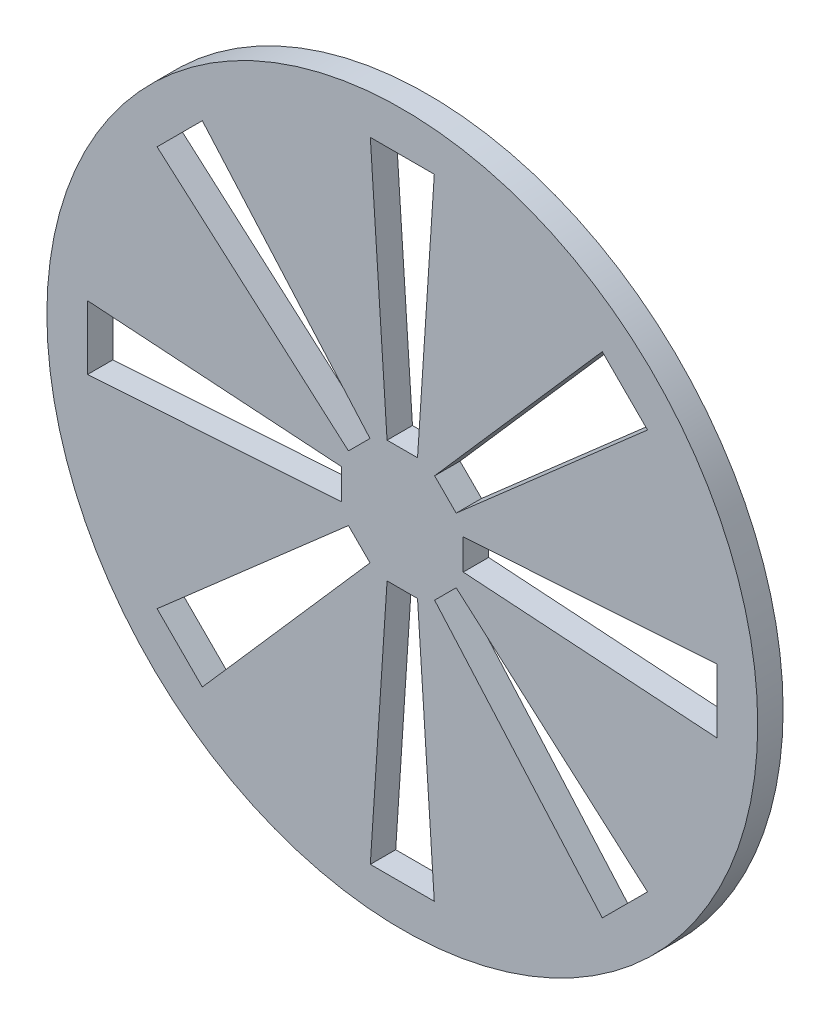
ISO-10303-21;
HEADER;
FILE_DESCRIPTION(('STEP AP214'),'2;1');
FILE_NAME('part.step','',(''),(''),'','','');
FILE_SCHEMA(('AUTOMOTIVE_DESIGN { 1 0 10303 214 1 1 1 1 }'));
ENDSEC;
DATA;
#1=APPLICATION_CONTEXT('core data for automotive mechanical design processes');
#2=APPLICATION_PROTOCOL_DEFINITION('international standard','automotive_design',2000,#1);
#3=PRODUCT_CONTEXT('',#1,'mechanical');
#4=PRODUCT('Part','Part','',(#3));
#5=PRODUCT_RELATED_PRODUCT_CATEGORY('part','',(#4));
#6=PRODUCT_DEFINITION_FORMATION('','',#4);
#7=PRODUCT_DEFINITION_CONTEXT('part definition',#1,'design');
#8=PRODUCT_DEFINITION('design','',#6,#7);
#9=PRODUCT_DEFINITION_SHAPE('','',#8);
#10=(LENGTH_UNIT() NAMED_UNIT(*) SI_UNIT(.MILLI.,.METRE.));
#11=(NAMED_UNIT(*) PLANE_ANGLE_UNIT() SI_UNIT($,.RADIAN.));
#12=(NAMED_UNIT(*) SI_UNIT($,.STERADIAN.) SOLID_ANGLE_UNIT());
#13=UNCERTAINTY_MEASURE_WITH_UNIT(LENGTH_MEASURE(1.E-05),#10,'distance_accuracy_value','');
#14=(GEOMETRIC_REPRESENTATION_CONTEXT(3) GLOBAL_UNCERTAINTY_ASSIGNED_CONTEXT((#13)) GLOBAL_UNIT_ASSIGNED_CONTEXT((#10,
#11,#12)) REPRESENTATION_CONTEXT('',''));
#15=CARTESIAN_POINT('',(0.,0.,0.));
#16=DIRECTION('',(0.,0.,1.));
#17=DIRECTION('',(1.,0.,0.));
#18=AXIS2_PLACEMENT_3D('',#15,#16,#17);
#19=CARTESIAN_POINT('',(0.,0.,2.5));
#20=DIRECTION('',(0.,0.,1.));
#21=DIRECTION('',(1.,0.,0.));
#22=AXIS2_PLACEMENT_3D('',#19,#20,#21);
#23=PLANE('',#22);
#24=CARTESIAN_POINT('',(0.,0.,2.5));
#25=DIRECTION('',(0.,0.,1.));
#26=DIRECTION('',(1.,0.,0.));
#27=AXIS2_PLACEMENT_3D('',#24,#25,#26);
#28=CIRCLE('',#27,35.);
#29=CARTESIAN_POINT('',(35.,0.,2.5));
#30=VERTEX_POINT('',#29);
#31=EDGE_CURVE('E11',#30,#30,#28,.T.);
#32=ORIENTED_EDGE('',*,*,#31,.T.);
#33=EDGE_LOOP('',(#32));
#34=FACE_BOUND('',#33,.T.);
#35=DIRECTION('',(1.,0.,0.));
#36=VECTOR('',#35,1.);
#37=CARTESIAN_POINT('',(-1.5,6.,2.5));
#38=LINE('',#37,#36);
#39=CARTESIAN_POINT('',(-1.5,6.,2.5));
#40=VERTEX_POINT('',#39);
#41=CARTESIAN_POINT('',(1.5,6.,2.5));
#42=VERTEX_POINT('',#41);
#43=EDGE_CURVE('E470',#40,#42,#38,.T.);
#44=ORIENTED_EDGE('',*,*,#43,.F.);
#45=DIRECTION('',(0.0658567199264505,-0.997829089794705,0.));
#46=VECTOR('',#45,1.);
#47=CARTESIAN_POINT('',(-3.15,31.,2.5));
#48=LINE('',#47,#46);
#49=CARTESIAN_POINT('',(-3.15,31.,2.5));
#50=VERTEX_POINT('',#49);
#51=EDGE_CURVE('E468',#50,#40,#48,.T.);
#52=ORIENTED_EDGE('',*,*,#51,.F.);
#53=DIRECTION('',(-1.,0.,0.));
#54=VECTOR('',#53,1.);
#55=CARTESIAN_POINT('',(3.15,31.,2.5));
#56=LINE('',#55,#54);
#57=CARTESIAN_POINT('',(3.15,31.,2.5));
#58=VERTEX_POINT('',#57);
#59=EDGE_CURVE('E476',#58,#50,#56,.T.);
#60=ORIENTED_EDGE('',*,*,#59,.F.);
#61=DIRECTION('',(0.0658567199264505,0.997829089794705,0.));
#62=VECTOR('',#61,1.);
#63=CARTESIAN_POINT('',(3.15,31.,2.5));
#64=LINE('',#63,#62);
#65=EDGE_CURVE('E473',#42,#58,#64,.T.);
#66=ORIENTED_EDGE('',*,*,#65,.F.);
#67=EDGE_LOOP('',(#44,#52,#60,#66));
#68=FACE_BOUND('',#67,.T.);
#69=DIRECTION('',(-0.659003982612336,-0.752139449105736,0.));
#70=VECTOR('',#69,1.);
#71=CARTESIAN_POINT('',(19.6929238560454,24.1476965775208,2.5));
#72=LINE('',#71,#70);
#73=CARTESIAN_POINT('',(19.6929238560454,24.1476965775208,2.5));
#74=VERTEX_POINT('',#73);
#75=CARTESIAN_POINT('',(3.18198051533947,5.3033008588991,2.5));
#76=VERTEX_POINT('',#75);
#77=EDGE_CURVE('E439',#74,#76,#72,.T.);
#78=ORIENTED_EDGE('',*,*,#77,.F.);
#79=DIRECTION('',(-0.707106781186548,0.707106781186548,0.));
#80=VECTOR('',#79,1.);
#81=CARTESIAN_POINT('',(24.1476965775206,19.6929238560455,2.5));
#82=LINE('',#81,#80);
#83=CARTESIAN_POINT('',(24.1476965775206,19.6929238560455,2.5));
#84=VERTEX_POINT('',#83);
#85=EDGE_CURVE('E437',#84,#74,#82,.T.);
#86=ORIENTED_EDGE('',*,*,#85,.F.);
#87=DIRECTION('',(0.752139449105729,0.659003982612344,0.));
#88=VECTOR('',#87,1.);
#89=CARTESIAN_POINT('',(24.1476965775206,19.6929238560455,2.5));
#90=LINE('',#89,#88);
#91=CARTESIAN_POINT('',(5.30330085889911,3.18198051533946,2.5));
#92=VERTEX_POINT('',#91);
#93=EDGE_CURVE('E445',#92,#84,#90,.T.);
#94=ORIENTED_EDGE('',*,*,#93,.F.);
#95=DIRECTION('',(0.707106781186546,-0.707106781186549,0.));
#96=VECTOR('',#95,1.);
#97=CARTESIAN_POINT('',(3.18198051533947,5.3033008588991,2.5));
#98=LINE('',#97,#96);
#99=EDGE_CURVE('E442',#76,#92,#98,.T.);
#100=ORIENTED_EDGE('',*,*,#99,.F.);
#101=EDGE_LOOP('',(#78,#86,#94,#100));
#102=FACE_BOUND('',#101,.T.);
#103=DIRECTION('',(-0.997829089794704,-0.0658567199264636,0.));
#104=VECTOR('',#103,1.);
#105=CARTESIAN_POINT('',(31.0000000000002,3.15000000000032,2.5));
#106=LINE('',#105,#104);
#107=CARTESIAN_POINT('',(31.0000000000002,3.15000000000032,2.5));
#108=VERTEX_POINT('',#107);
#109=CARTESIAN_POINT('',(6.00000000000001,1.49999999999998,2.5));
#110=VERTEX_POINT('',#109);
#111=EDGE_CURVE('E408',#108,#110,#106,.T.);
#112=ORIENTED_EDGE('',*,*,#111,.F.);
#113=DIRECTION('',(0.,1.,0.));
#114=VECTOR('',#113,1.);
#115=CARTESIAN_POINT('',(31.0000000000002,-3.14999999999968,2.5));
#116=LINE('',#115,#114);
#117=CARTESIAN_POINT('',(31.0000000000002,-3.14999999999968,2.5));
#118=VERTEX_POINT('',#117);
#119=EDGE_CURVE('E406',#118,#108,#116,.T.);
#120=ORIENTED_EDGE('',*,*,#119,.F.);
#121=DIRECTION('',(0.997829089794706,-0.0658567199264364,0.));
#122=VECTOR('',#121,1.);
#123=CARTESIAN_POINT('',(31.0000000000002,-3.14999999999968,2.5));
#124=LINE('',#123,#122);
#125=CARTESIAN_POINT('',(5.99999999999999,-1.50000000000002,2.5));
#126=VERTEX_POINT('',#125);
#127=EDGE_CURVE('E414',#126,#118,#124,.T.);
#128=ORIENTED_EDGE('',*,*,#127,.F.);
#129=DIRECTION('',(0.,-1.,0.));
#130=VECTOR('',#129,1.);
#131=CARTESIAN_POINT('',(6.00000000000001,1.49999999999998,2.5));
#132=LINE('',#131,#130);
#133=EDGE_CURVE('E411',#110,#126,#132,.T.);
#134=ORIENTED_EDGE('',*,*,#133,.F.);
#135=EDGE_LOOP('',(#112,#120,#128,#134));
#136=FACE_BOUND('',#135,.T.);
#137=DIRECTION('',(-0.752139449105746,0.659003982612325,0.));
#138=VECTOR('',#137,1.);
#139=CARTESIAN_POINT('',(24.147696577521,-19.6929238560451,2.5));
#140=LINE('',#139,#138);
#141=CARTESIAN_POINT('',(24.147696577521,-19.6929238560451,2.5));
#142=VERTEX_POINT('',#141);
#143=CARTESIAN_POINT('',(5.30330085889909,-3.18198051533949,2.5));
#144=VERTEX_POINT('',#143);
#145=EDGE_CURVE('E377',#142,#144,#140,.T.);
#146=ORIENTED_EDGE('',*,*,#145,.F.);
#147=DIRECTION('',(0.707106781186548,0.707106781186548,0.));
#148=VECTOR('',#147,1.);
#149=CARTESIAN_POINT('',(19.6929238560457,-24.1476965775203,2.5));
#150=LINE('',#149,#148);
#151=CARTESIAN_POINT('',(19.6929238560457,-24.1476965775203,2.5));
#152=VERTEX_POINT('',#151);
#153=EDGE_CURVE('E375',#152,#142,#150,.T.);
#154=ORIENTED_EDGE('',*,*,#153,.F.);
#155=DIRECTION('',(0.659003982612355,-0.752139449105719,0.));
#156=VECTOR('',#155,1.);
#157=CARTESIAN_POINT('',(19.6929238560457,-24.1476965775203,2.5));
#158=LINE('',#157,#156);
#159=CARTESIAN_POINT('',(3.18198051533944,-5.30330085889912,2.5));
#160=VERTEX_POINT('',#159);
#161=EDGE_CURVE('E383',#160,#152,#158,.T.);
#162=ORIENTED_EDGE('',*,*,#161,.F.);
#163=DIRECTION('',(-0.707106781186551,-0.707106781186544,0.));
#164=VECTOR('',#163,1.);
#165=CARTESIAN_POINT('',(5.30330085889909,-3.18198051533949,2.5));
#166=LINE('',#165,#164);
#167=EDGE_CURVE('E380',#144,#160,#166,.T.);
#168=ORIENTED_EDGE('',*,*,#167,.F.);
#169=EDGE_LOOP('',(#146,#154,#162,#168));
#170=FACE_BOUND('',#169,.T.);
#171=DIRECTION('',(-0.0658567199264506,0.997829089794705,0.));
#172=VECTOR('',#171,1.);
#173=CARTESIAN_POINT('',(3.15000000000051,-30.9999999999999,2.5));
#174=LINE('',#173,#172);
#175=CARTESIAN_POINT('',(3.15000000000051,-30.9999999999999,2.5));
#176=VERTEX_POINT('',#175);
#177=CARTESIAN_POINT('',(1.50000000000051,-5.99999999999988,2.5));
#178=VERTEX_POINT('',#177);
#179=EDGE_CURVE('E346',#176,#178,#174,.T.);
#180=ORIENTED_EDGE('',*,*,#179,.F.);
#181=DIRECTION('',(1.,0.,0.));
#182=VECTOR('',#181,1.);
#183=CARTESIAN_POINT('',(-3.14999999999949,-30.9999999999999,2.5));
#184=LINE('',#183,#182);
#185=CARTESIAN_POINT('',(-3.14999999999949,-30.9999999999999,2.5));
#186=VERTEX_POINT('',#185);
#187=EDGE_CURVE('E344',#186,#176,#184,.T.);
#188=ORIENTED_EDGE('',*,*,#187,.F.);
#189=DIRECTION('',(-0.0658567199264504,-0.997829089794705,0.));
#190=VECTOR('',#189,1.);
#191=CARTESIAN_POINT('',(-3.14999999999949,-30.9999999999999,2.5));
#192=LINE('',#191,#190);
#193=CARTESIAN_POINT('',(-1.49999999999949,-5.99999999999988,2.5));
#194=VERTEX_POINT('',#193);
#195=EDGE_CURVE('E352',#194,#186,#192,.T.);
#196=ORIENTED_EDGE('',*,*,#195,.F.);
#197=DIRECTION('',(-1.,0.,0.));
#198=VECTOR('',#197,1.);
#199=CARTESIAN_POINT('',(1.50000000000051,-5.99999999999988,2.5));
#200=LINE('',#199,#198);
#201=EDGE_CURVE('E349',#178,#194,#200,.T.);
#202=ORIENTED_EDGE('',*,*,#201,.F.);
#203=EDGE_LOOP('',(#180,#188,#196,#202));
#204=FACE_BOUND('',#203,.T.);
#205=DIRECTION('',(0.659003982612326,0.752139449105745,0.));
#206=VECTOR('',#205,1.);
#207=CARTESIAN_POINT('',(-19.6929238560449,-24.1476965775207,2.5));
#208=LINE('',#207,#206);
#209=CARTESIAN_POINT('',(-19.6929238560449,-24.1476965775207,2.5));
#210=VERTEX_POINT('',#209);
#211=CARTESIAN_POINT('',(-3.18198051533951,-5.30330085889908,2.5));
#212=VERTEX_POINT('',#211);
#213=EDGE_CURVE('E315',#210,#212,#208,.T.);
#214=ORIENTED_EDGE('',*,*,#213,.F.);
#215=DIRECTION('',(0.707106781186547,-0.707106781186547,0.));
#216=VECTOR('',#215,1.);
#217=CARTESIAN_POINT('',(-24.1476965775201,-19.6929238560454,2.5));
#218=LINE('',#217,#216);
#219=CARTESIAN_POINT('',(-24.1476965775201,-19.6929238560454,2.5));
#220=VERTEX_POINT('',#219);
#221=EDGE_CURVE('E313',#220,#210,#218,.T.);
#222=ORIENTED_EDGE('',*,*,#221,.F.);
#223=DIRECTION('',(-0.752139449105721,-0.659003982612353,0.));
#224=VECTOR('',#223,1.);
#225=CARTESIAN_POINT('',(-24.1476965775201,-19.6929238560454,2.5));
#226=LINE('',#225,#224);
#227=CARTESIAN_POINT('',(-5.30330085889914,-3.18198051533942,2.5));
#228=VERTEX_POINT('',#227);
#229=EDGE_CURVE('E321',#228,#220,#226,.T.);
#230=ORIENTED_EDGE('',*,*,#229,.F.);
#231=DIRECTION('',(-0.707106781186541,0.707106781186554,0.));
#232=VECTOR('',#231,1.);
#233=CARTESIAN_POINT('',(-3.18198051533951,-5.30330085889908,2.5));
#234=LINE('',#233,#232);
#235=EDGE_CURVE('E318',#212,#228,#234,.T.);
#236=ORIENTED_EDGE('',*,*,#235,.F.);
#237=EDGE_LOOP('',(#214,#222,#230,#236));
#238=FACE_BOUND('',#237,.T.);
#239=DIRECTION('',(0.997829089794704,0.0658567199264618,0.));
#240=VECTOR('',#239,1.);
#241=CARTESIAN_POINT('',(-30.9999999999997,-3.1500000000002,2.5));
#242=LINE('',#241,#240);
#243=CARTESIAN_POINT('',(-30.9999999999997,-3.1500000000002,2.5));
#244=VERTEX_POINT('',#243);
#245=CARTESIAN_POINT('',(-6.00000000000002,-1.49999999999994,2.5));
#246=VERTEX_POINT('',#245);
#247=EDGE_CURVE('E284',#244,#246,#242,.T.);
#248=ORIENTED_EDGE('',*,*,#247,.F.);
#249=DIRECTION('',(0.,-1.,0.));
#250=VECTOR('',#249,1.);
#251=CARTESIAN_POINT('',(-30.9999999999997,3.1499999999998,2.5));
#252=LINE('',#251,#250);
#253=CARTESIAN_POINT('',(-30.9999999999997,3.1499999999998,2.5));
#254=VERTEX_POINT('',#253);
#255=EDGE_CURVE('E282',#254,#244,#252,.T.);
#256=ORIENTED_EDGE('',*,*,#255,.F.);
#257=DIRECTION('',(-0.997829089794705,0.065856719926441,0.));
#258=VECTOR('',#257,1.);
#259=CARTESIAN_POINT('',(-30.9999999999997,3.1499999999998,2.5));
#260=LINE('',#259,#258);
#261=CARTESIAN_POINT('',(-5.99999999999999,1.50000000000006,2.5));
#262=VERTEX_POINT('',#261);
#263=EDGE_CURVE('E290',#262,#254,#260,.T.);
#264=ORIENTED_EDGE('',*,*,#263,.F.);
#265=DIRECTION('',(0.,1.,0.));
#266=VECTOR('',#265,1.);
#267=CARTESIAN_POINT('',(-6.00000000000002,-1.49999999999994,2.5));
#268=LINE('',#267,#266);
#269=EDGE_CURVE('E287',#246,#262,#268,.T.);
#270=ORIENTED_EDGE('',*,*,#269,.F.);
#271=EDGE_LOOP('',(#248,#256,#264,#270));
#272=FACE_BOUND('',#271,.T.);
#273=DIRECTION('',(0.752139449105736,-0.659003982612336,0.));
#274=VECTOR('',#273,1.);
#275=CARTESIAN_POINT('',(-24.1476965775205,19.6929238560452,2.5));
#276=LINE('',#275,#274);
#277=CARTESIAN_POINT('',(-24.1476965775205,19.6929238560452,2.5));
#278=VERTEX_POINT('',#277);
#279=CARTESIAN_POINT('',(-5.30330085889907,3.18198051533953,2.5));
#280=VERTEX_POINT('',#279);
#281=EDGE_CURVE('E254',#278,#280,#276,.T.);
#282=ORIENTED_EDGE('',*,*,#281,.F.);
#283=DIRECTION('',(-0.707106781186547,-0.707106781186548,0.));
#284=VECTOR('',#283,1.);
#285=CARTESIAN_POINT('',(-19.6929238560452,24.1476965775204,2.5));
#286=LINE('',#285,#284);
#287=CARTESIAN_POINT('',(-19.6929238560452,24.1476965775204,2.5));
#288=VERTEX_POINT('',#287);
#289=EDGE_CURVE('E246',#288,#278,#286,.T.);
#290=ORIENTED_EDGE('',*,*,#289,.F.);
#291=DIRECTION('',(-0.659003982612343,0.75213944910573,0.));
#292=VECTOR('',#291,1.);
#293=CARTESIAN_POINT('',(-19.6929238560452,24.1476965775204,2.5));
#294=LINE('',#293,#292);
#295=CARTESIAN_POINT('',(-3.1819805153394,5.30330085889915,2.5));
#296=VERTEX_POINT('',#295);
#297=EDGE_CURVE('E268',#296,#288,#294,.T.);
#298=ORIENTED_EDGE('',*,*,#297,.F.);
#299=DIRECTION('',(0.707106781186556,0.707106781186539,0.));
#300=VECTOR('',#299,1.);
#301=CARTESIAN_POINT('',(-5.30330085889907,3.18198051533953,2.5));
#302=LINE('',#301,#300);
#303=EDGE_CURVE('E266',#280,#296,#302,.T.);
#304=ORIENTED_EDGE('',*,*,#303,.F.);
#305=EDGE_LOOP('',(#282,#290,#298,#304));
#306=FACE_BOUND('',#305,.T.);
#307=ADVANCED_FACE('F37',(#34,#68,#102,#136,#170,#204,#238,#272,#306),#23,.T.);
#308=CARTESIAN_POINT('',(0.,0.,0.));
#309=DIRECTION('',(0.,0.,1.));
#310=DIRECTION('',(1.,0.,0.));
#311=AXIS2_PLACEMENT_3D('',#308,#309,#310);
#312=PLANE('',#311);
#313=DIRECTION('',(0.,-1.,0.));
#314=VECTOR('',#313,1.);
#315=CARTESIAN_POINT('',(-30.9999999999997,3.1499999999998,0.));
#316=LINE('',#315,#314);
#317=CARTESIAN_POINT('',(-30.9999999999997,3.1499999999998,0.));
#318=VERTEX_POINT('',#317);
#319=CARTESIAN_POINT('',(-30.9999999999997,-3.1500000000002,0.));
#320=VERTEX_POINT('',#319);
#321=EDGE_CURVE('E262',#318,#320,#316,.T.);
#322=ORIENTED_EDGE('',*,*,#321,.T.);
#323=DIRECTION('',(0.997829089794704,0.0658567199264618,0.));
#324=VECTOR('',#323,1.);
#325=CARTESIAN_POINT('',(-30.9999999999997,-3.1500000000002,0.));
#326=LINE('',#325,#324);
#327=CARTESIAN_POINT('',(-6.00000000000002,-1.49999999999994,0.));
#328=VERTEX_POINT('',#327);
#329=EDGE_CURVE('E295',#320,#328,#326,.T.);
#330=ORIENTED_EDGE('',*,*,#329,.T.);
#331=DIRECTION('',(0.,1.,0.));
#332=VECTOR('',#331,1.);
#333=CARTESIAN_POINT('',(-6.00000000000002,-1.49999999999994,0.));
#334=LINE('',#333,#332);
#335=CARTESIAN_POINT('',(-5.99999999999998,1.50000000000006,0.));
#336=VERTEX_POINT('',#335);
#337=EDGE_CURVE('E298',#328,#336,#334,.T.);
#338=ORIENTED_EDGE('',*,*,#337,.T.);
#339=DIRECTION('',(-0.997829089794705,0.065856719926441,0.));
#340=VECTOR('',#339,1.);
#341=CARTESIAN_POINT('',(-30.9999999999997,3.1499999999998,0.));
#342=LINE('',#341,#340);
#343=EDGE_CURVE('E285',#336,#318,#342,.T.);
#344=ORIENTED_EDGE('',*,*,#343,.T.);
#345=EDGE_LOOP('',(#322,#330,#338,#344));
#346=FACE_BOUND('',#345,.T.);
#347=DIRECTION('',(1.,0.,0.));
#348=VECTOR('',#347,1.);
#349=CARTESIAN_POINT('',(-3.14999999999949,-30.9999999999999,0.));
#350=LINE('',#349,#348);
#351=CARTESIAN_POINT('',(-3.14999999999948,-30.9999999999999,0.));
#352=VERTEX_POINT('',#351);
#353=CARTESIAN_POINT('',(3.15000000000051,-30.9999999999999,0.));
#354=VERTEX_POINT('',#353);
#355=EDGE_CURVE('E343',#352,#354,#350,.T.);
#356=ORIENTED_EDGE('',*,*,#355,.T.);
#357=DIRECTION('',(-0.0658567199264506,0.997829089794705,0.));
#358=VECTOR('',#357,1.);
#359=CARTESIAN_POINT('',(3.15000000000051,-30.9999999999999,0.));
#360=LINE('',#359,#358);
#361=CARTESIAN_POINT('',(1.50000000000051,-5.99999999999988,0.));
#362=VERTEX_POINT('',#361);
#363=EDGE_CURVE('E357',#354,#362,#360,.T.);
#364=ORIENTED_EDGE('',*,*,#363,.T.);
#365=DIRECTION('',(-1.,0.,0.));
#366=VECTOR('',#365,1.);
#367=CARTESIAN_POINT('',(1.50000000000051,-5.99999999999988,0.));
#368=LINE('',#367,#366);
#369=CARTESIAN_POINT('',(-1.49999999999949,-5.99999999999988,0.));
#370=VERTEX_POINT('',#369);
#371=EDGE_CURVE('E360',#362,#370,#368,.T.);
#372=ORIENTED_EDGE('',*,*,#371,.T.);
#373=DIRECTION('',(-0.0658567199264504,-0.997829089794705,0.));
#374=VECTOR('',#373,1.);
#375=CARTESIAN_POINT('',(-3.14999999999949,-30.9999999999999,0.));
#376=LINE('',#375,#374);
#377=EDGE_CURVE('E347',#370,#352,#376,.T.);
#378=ORIENTED_EDGE('',*,*,#377,.T.);
#379=EDGE_LOOP('',(#356,#364,#372,#378));
#380=FACE_BOUND('',#379,.T.);
#381=DIRECTION('',(0.,1.,0.));
#382=VECTOR('',#381,1.);
#383=CARTESIAN_POINT('',(31.0000000000002,-3.14999999999968,0.));
#384=LINE('',#383,#382);
#385=CARTESIAN_POINT('',(31.0000000000002,-3.14999999999968,0.));
#386=VERTEX_POINT('',#385);
#387=CARTESIAN_POINT('',(31.0000000000002,3.15000000000032,0.));
#388=VERTEX_POINT('',#387);
#389=EDGE_CURVE('E405',#386,#388,#384,.T.);
#390=ORIENTED_EDGE('',*,*,#389,.T.);
#391=DIRECTION('',(-0.997829089794704,-0.0658567199264636,0.));
#392=VECTOR('',#391,1.);
#393=CARTESIAN_POINT('',(31.0000000000002,3.15000000000032,0.));
#394=LINE('',#393,#392);
#395=CARTESIAN_POINT('',(6.00000000000001,1.49999999999998,0.));
#396=VERTEX_POINT('',#395);
#397=EDGE_CURVE('E419',#388,#396,#394,.T.);
#398=ORIENTED_EDGE('',*,*,#397,.T.);
#399=DIRECTION('',(0.,-1.,0.));
#400=VECTOR('',#399,1.);
#401=CARTESIAN_POINT('',(6.00000000000001,1.49999999999998,0.));
#402=LINE('',#401,#400);
#403=CARTESIAN_POINT('',(5.99999999999999,-1.50000000000002,0.));
#404=VERTEX_POINT('',#403);
#405=EDGE_CURVE('E422',#396,#404,#402,.T.);
#406=ORIENTED_EDGE('',*,*,#405,.T.);
#407=DIRECTION('',(0.997829089794706,-0.0658567199264364,0.));
#408=VECTOR('',#407,1.);
#409=CARTESIAN_POINT('',(31.0000000000002,-3.14999999999968,0.));
#410=LINE('',#409,#408);
#411=EDGE_CURVE('E409',#404,#386,#410,.T.);
#412=ORIENTED_EDGE('',*,*,#411,.T.);
#413=EDGE_LOOP('',(#390,#398,#406,#412));
#414=FACE_BOUND('',#413,.T.);
#415=DIRECTION('',(0.0658567199264505,-0.997829089794705,0.));
#416=VECTOR('',#415,1.);
#417=CARTESIAN_POINT('',(-3.15,31.,0.));
#418=LINE('',#417,#416);
#419=CARTESIAN_POINT('',(-3.15,31.,0.));
#420=VERTEX_POINT('',#419);
#421=CARTESIAN_POINT('',(-1.5,6.,0.));
#422=VERTEX_POINT('',#421);
#423=EDGE_CURVE('E467',#420,#422,#418,.T.);
#424=ORIENTED_EDGE('',*,*,#423,.T.);
#425=DIRECTION('',(1.,0.,0.));
#426=VECTOR('',#425,1.);
#427=CARTESIAN_POINT('',(-1.5,6.,0.));
#428=LINE('',#427,#426);
#429=CARTESIAN_POINT('',(1.5,6.,0.));
#430=VERTEX_POINT('',#429);
#431=EDGE_CURVE('E481',#422,#430,#428,.T.);
#432=ORIENTED_EDGE('',*,*,#431,.T.);
#433=DIRECTION('',(0.0658567199264505,0.997829089794705,0.));
#434=VECTOR('',#433,1.);
#435=CARTESIAN_POINT('',(3.15,31.,0.));
#436=LINE('',#435,#434);
#437=CARTESIAN_POINT('',(3.15,31.,0.));
#438=VERTEX_POINT('',#437);
#439=EDGE_CURVE('E484',#430,#438,#436,.T.);
#440=ORIENTED_EDGE('',*,*,#439,.T.);
#441=DIRECTION('',(-1.,0.,0.));
#442=VECTOR('',#441,1.);
#443=CARTESIAN_POINT('',(3.15,31.,0.));
#444=LINE('',#443,#442);
#445=EDGE_CURVE('E471',#438,#420,#444,.T.);
#446=ORIENTED_EDGE('',*,*,#445,.T.);
#447=EDGE_LOOP('',(#424,#432,#440,#446));
#448=FACE_BOUND('',#447,.T.);
#449=CARTESIAN_POINT('',(0.,0.,0.));
#450=DIRECTION('',(0.,0.,1.));
#451=DIRECTION('',(1.,0.,0.));
#452=AXIS2_PLACEMENT_3D('',#449,#450,#451);
#453=CIRCLE('',#452,35.);
#454=CARTESIAN_POINT('',(35.,0.,0.));
#455=VERTEX_POINT('',#454);
#456=EDGE_CURVE('E41',#455,#455,#453,.T.);
#457=ORIENTED_EDGE('',*,*,#456,.F.);
#458=EDGE_LOOP('',(#457));
#459=FACE_BOUND('',#458,.T.);
#460=DIRECTION('',(-0.707106781186548,0.707106781186548,0.));
#461=VECTOR('',#460,1.);
#462=CARTESIAN_POINT('',(24.1476965775206,19.6929238560455,0.));
#463=LINE('',#462,#461);
#464=CARTESIAN_POINT('',(24.1476965775206,19.6929238560455,0.));
#465=VERTEX_POINT('',#464);
#466=CARTESIAN_POINT('',(19.6929238560454,24.1476965775208,0.));
#467=VERTEX_POINT('',#466);
#468=EDGE_CURVE('E436',#465,#467,#463,.T.);
#469=ORIENTED_EDGE('',*,*,#468,.T.);
#470=DIRECTION('',(-0.659003982612336,-0.752139449105736,0.));
#471=VECTOR('',#470,1.);
#472=CARTESIAN_POINT('',(19.6929238560454,24.1476965775208,0.));
#473=LINE('',#472,#471);
#474=CARTESIAN_POINT('',(3.18198051533947,5.3033008588991,0.));
#475=VERTEX_POINT('',#474);
#476=EDGE_CURVE('E450',#467,#475,#473,.T.);
#477=ORIENTED_EDGE('',*,*,#476,.T.);
#478=DIRECTION('',(0.707106781186546,-0.707106781186549,0.));
#479=VECTOR('',#478,1.);
#480=CARTESIAN_POINT('',(3.18198051533947,5.3033008588991,0.));
#481=LINE('',#480,#479);
#482=CARTESIAN_POINT('',(5.30330085889911,3.18198051533945,0.));
#483=VERTEX_POINT('',#482);
#484=EDGE_CURVE('E453',#475,#483,#481,.T.);
#485=ORIENTED_EDGE('',*,*,#484,.T.);
#486=DIRECTION('',(0.752139449105729,0.659003982612344,0.));
#487=VECTOR('',#486,1.);
#488=CARTESIAN_POINT('',(24.1476965775206,19.6929238560455,0.));
#489=LINE('',#488,#487);
#490=EDGE_CURVE('E440',#483,#465,#489,.T.);
#491=ORIENTED_EDGE('',*,*,#490,.T.);
#492=EDGE_LOOP('',(#469,#477,#485,#491));
#493=FACE_BOUND('',#492,.T.);
#494=DIRECTION('',(0.707106781186548,0.707106781186548,0.));
#495=VECTOR('',#494,1.);
#496=CARTESIAN_POINT('',(19.6929238560457,-24.1476965775203,0.));
#497=LINE('',#496,#495);
#498=CARTESIAN_POINT('',(19.6929238560457,-24.1476965775203,0.));
#499=VERTEX_POINT('',#498);
#500=CARTESIAN_POINT('',(24.147696577521,-19.6929238560451,0.));
#501=VERTEX_POINT('',#500);
#502=EDGE_CURVE('E374',#499,#501,#497,.T.);
#503=ORIENTED_EDGE('',*,*,#502,.T.);
#504=DIRECTION('',(-0.752139449105746,0.659003982612325,0.));
#505=VECTOR('',#504,1.);
#506=CARTESIAN_POINT('',(24.147696577521,-19.6929238560451,0.));
#507=LINE('',#506,#505);
#508=CARTESIAN_POINT('',(5.30330085889909,-3.18198051533949,0.));
#509=VERTEX_POINT('',#508);
#510=EDGE_CURVE('E388',#501,#509,#507,.T.);
#511=ORIENTED_EDGE('',*,*,#510,.T.);
#512=DIRECTION('',(-0.707106781186551,-0.707106781186544,0.));
#513=VECTOR('',#512,1.);
#514=CARTESIAN_POINT('',(5.30330085889909,-3.18198051533949,0.));
#515=LINE('',#514,#513);
#516=CARTESIAN_POINT('',(3.18198051533944,-5.30330085889912,0.));
#517=VERTEX_POINT('',#516);
#518=EDGE_CURVE('E391',#509,#517,#515,.T.);
#519=ORIENTED_EDGE('',*,*,#518,.T.);
#520=DIRECTION('',(0.659003982612355,-0.752139449105719,0.));
#521=VECTOR('',#520,1.);
#522=CARTESIAN_POINT('',(19.6929238560457,-24.1476965775203,0.));
#523=LINE('',#522,#521);
#524=EDGE_CURVE('E378',#517,#499,#523,.T.);
#525=ORIENTED_EDGE('',*,*,#524,.T.);
#526=EDGE_LOOP('',(#503,#511,#519,#525));
#527=FACE_BOUND('',#526,.T.);
#528=DIRECTION('',(0.707106781186547,-0.707106781186547,0.));
#529=VECTOR('',#528,1.);
#530=CARTESIAN_POINT('',(-24.1476965775201,-19.6929238560454,0.));
#531=LINE('',#530,#529);
#532=CARTESIAN_POINT('',(-24.1476965775201,-19.6929238560454,0.));
#533=VERTEX_POINT('',#532);
#534=CARTESIAN_POINT('',(-19.6929238560449,-24.1476965775207,0.));
#535=VERTEX_POINT('',#534);
#536=EDGE_CURVE('E312',#533,#535,#531,.T.);
#537=ORIENTED_EDGE('',*,*,#536,.T.);
#538=DIRECTION('',(0.659003982612326,0.752139449105745,0.));
#539=VECTOR('',#538,1.);
#540=CARTESIAN_POINT('',(-19.6929238560449,-24.1476965775207,0.));
#541=LINE('',#540,#539);
#542=CARTESIAN_POINT('',(-3.18198051533951,-5.30330085889908,0.));
#543=VERTEX_POINT('',#542);
#544=EDGE_CURVE('E326',#535,#543,#541,.T.);
#545=ORIENTED_EDGE('',*,*,#544,.T.);
#546=DIRECTION('',(-0.707106781186541,0.707106781186554,0.));
#547=VECTOR('',#546,1.);
#548=CARTESIAN_POINT('',(-3.18198051533951,-5.30330085889908,0.));
#549=LINE('',#548,#547);
#550=CARTESIAN_POINT('',(-5.30330085889913,-3.18198051533942,0.));
#551=VERTEX_POINT('',#550);
#552=EDGE_CURVE('E329',#543,#551,#549,.T.);
#553=ORIENTED_EDGE('',*,*,#552,.T.);
#554=DIRECTION('',(-0.752139449105721,-0.659003982612353,0.));
#555=VECTOR('',#554,1.);
#556=CARTESIAN_POINT('',(-24.1476965775201,-19.6929238560454,0.));
#557=LINE('',#556,#555);
#558=EDGE_CURVE('E316',#551,#533,#557,.T.);
#559=ORIENTED_EDGE('',*,*,#558,.T.);
#560=EDGE_LOOP('',(#537,#545,#553,#559));
#561=FACE_BOUND('',#560,.T.);
#562=DIRECTION('',(-0.707106781186547,-0.707106781186548,0.));
#563=VECTOR('',#562,1.);
#564=CARTESIAN_POINT('',(-19.6929238560452,24.1476965775204,0.));
#565=LINE('',#564,#563);
#566=CARTESIAN_POINT('',(-19.6929238560452,24.1476965775204,0.));
#567=VERTEX_POINT('',#566);
#568=CARTESIAN_POINT('',(-24.1476965775205,19.6929238560452,0.));
#569=VERTEX_POINT('',#568);
#570=EDGE_CURVE('E60',#567,#569,#565,.T.);
#571=ORIENTED_EDGE('',*,*,#570,.T.);
#572=DIRECTION('',(0.752139449105736,-0.659003982612336,0.));
#573=VECTOR('',#572,1.);
#574=CARTESIAN_POINT('',(-24.1476965775205,19.6929238560452,0.));
#575=LINE('',#574,#573);
#576=CARTESIAN_POINT('',(-5.30330085889907,3.18198051533953,0.));
#577=VERTEX_POINT('',#576);
#578=EDGE_CURVE('E261',#569,#577,#575,.T.);
#579=ORIENTED_EDGE('',*,*,#578,.T.);
#580=DIRECTION('',(0.707106781186556,0.707106781186539,0.));
#581=VECTOR('',#580,1.);
#582=CARTESIAN_POINT('',(-5.30330085889907,3.18198051533953,0.));
#583=LINE('',#582,#581);
#584=CARTESIAN_POINT('',(-3.1819805153394,5.30330085889914,0.));
#585=VERTEX_POINT('',#584);
#586=EDGE_CURVE('E274',#577,#585,#583,.T.);
#587=ORIENTED_EDGE('',*,*,#586,.T.);
#588=DIRECTION('',(-0.659003982612343,0.75213944910573,0.));
#589=VECTOR('',#588,1.);
#590=CARTESIAN_POINT('',(-19.6929238560452,24.1476965775204,0.));
#591=LINE('',#590,#589);
#592=EDGE_CURVE('E255',#585,#567,#591,.T.);
#593=ORIENTED_EDGE('',*,*,#592,.T.);
#594=EDGE_LOOP('',(#571,#579,#587,#593));
#595=FACE_BOUND('',#594,.T.);
#596=ADVANCED_FACE('F503',(#346,#380,#414,#448,#459,#493,#527,#561,#595),#312,.F.);
#597=CARTESIAN_POINT('',(0.,0.,2.5));
#598=DIRECTION('',(0.,0.,-1.));
#599=DIRECTION('',(-1.,0.,0.));
#600=AXIS2_PLACEMENT_3D('',#597,#598,#599);
#601=CYLINDRICAL_SURFACE('',#600,35.);
#602=ORIENTED_EDGE('',*,*,#31,.F.);
#603=EDGE_LOOP('',(#602));
#604=FACE_BOUND('',#603,.T.);
#605=ORIENTED_EDGE('',*,*,#456,.T.);
#606=EDGE_LOOP('',(#605));
#607=FACE_BOUND('',#606,.T.);
#608=ADVANCED_FACE('F39',(#604,#607),#601,.T.);
#609=CARTESIAN_POINT('',(-3.15,31.,2.5));
#610=DIRECTION('',(0.997829089794705,0.0658567199264505,0.));
#611=DIRECTION('',(-0.0658567199264505,0.997829089794705,0.));
#612=AXIS2_PLACEMENT_3D('',#609,#610,#611);
#613=PLANE('',#612);
#614=ORIENTED_EDGE('',*,*,#423,.F.);
#615=DIRECTION('',(0.,0.,-1.));
#616=VECTOR('',#615,1.);
#617=CARTESIAN_POINT('',(-3.15,31.,2.5));
#618=LINE('',#617,#616);
#619=EDGE_CURVE('E478',#50,#420,#618,.T.);
#620=ORIENTED_EDGE('',*,*,#619,.F.);
#621=ORIENTED_EDGE('',*,*,#51,.T.);
#622=DIRECTION('',(0.,0.,-1.));
#623=VECTOR('',#622,1.);
#624=CARTESIAN_POINT('',(-1.5,6.,2.5));
#625=LINE('',#624,#623);
#626=EDGE_CURVE('E495',#40,#422,#625,.T.);
#627=ORIENTED_EDGE('',*,*,#626,.T.);
#628=EDGE_LOOP('',(#614,#620,#621,#627));
#629=FACE_BOUND('',#628,.T.);
#630=ADVANCED_FACE('F527',(#629),#613,.T.);
#631=CARTESIAN_POINT('',(-1.5,6.,2.5));
#632=DIRECTION('',(0.,1.,0.));
#633=DIRECTION('',(0.,0.,1.));
#634=AXIS2_PLACEMENT_3D('',#631,#632,#633);
#635=PLANE('',#634);
#636=ORIENTED_EDGE('',*,*,#431,.F.);
#637=ORIENTED_EDGE('',*,*,#626,.F.);
#638=ORIENTED_EDGE('',*,*,#43,.T.);
#639=DIRECTION('',(0.,0.,-1.));
#640=VECTOR('',#639,1.);
#641=CARTESIAN_POINT('',(1.5,6.,2.5));
#642=LINE('',#641,#640);
#643=EDGE_CURVE('E493',#42,#430,#642,.T.);
#644=ORIENTED_EDGE('',*,*,#643,.T.);
#645=EDGE_LOOP('',(#636,#637,#638,#644));
#646=FACE_BOUND('',#645,.T.);
#647=ADVANCED_FACE('F530',(#646),#635,.T.);
#648=CARTESIAN_POINT('',(3.15,31.,2.5));
#649=DIRECTION('',(-0.997829089794705,0.0658567199264505,0.));
#650=DIRECTION('',(-0.0658567199264505,-0.997829089794705,0.));
#651=AXIS2_PLACEMENT_3D('',#648,#649,#650);
#652=PLANE('',#651);
#653=ORIENTED_EDGE('',*,*,#439,.F.);
#654=ORIENTED_EDGE('',*,*,#643,.F.);
#655=ORIENTED_EDGE('',*,*,#65,.T.);
#656=DIRECTION('',(0.,0.,-1.));
#657=VECTOR('',#656,1.);
#658=CARTESIAN_POINT('',(3.15,31.,2.5));
#659=LINE('',#658,#657);
#660=EDGE_CURVE('E491',#58,#438,#659,.T.);
#661=ORIENTED_EDGE('',*,*,#660,.T.);
#662=EDGE_LOOP('',(#653,#654,#655,#661));
#663=FACE_BOUND('',#662,.T.);
#664=ADVANCED_FACE('F533',(#663),#652,.T.);
#665=CARTESIAN_POINT('',(3.15,31.,2.5));
#666=DIRECTION('',(0.,-1.,0.));
#667=DIRECTION('',(0.,0.,-1.));
#668=AXIS2_PLACEMENT_3D('',#665,#666,#667);
#669=PLANE('',#668);
#670=ORIENTED_EDGE('',*,*,#445,.F.);
#671=ORIENTED_EDGE('',*,*,#660,.F.);
#672=ORIENTED_EDGE('',*,*,#59,.T.);
#673=ORIENTED_EDGE('',*,*,#619,.T.);
#674=EDGE_LOOP('',(#670,#671,#672,#673));
#675=FACE_BOUND('',#674,.T.);
#676=ADVANCED_FACE('F537',(#675),#669,.T.);
#677=CARTESIAN_POINT('',(24.1476965775206,19.6929238560455,2.5));
#678=DIRECTION('',(-0.707106781186548,-0.707106781186548,0.));
#679=DIRECTION('',(0.707106781186548,-0.707106781186548,0.));
#680=AXIS2_PLACEMENT_3D('',#677,#678,#679);
#681=PLANE('',#680);
#682=ORIENTED_EDGE('',*,*,#468,.F.);
#683=DIRECTION('',(0.,0.,-1.));
#684=VECTOR('',#683,1.);
#685=CARTESIAN_POINT('',(24.1476965775206,19.6929238560455,2.5));
#686=LINE('',#685,#684);
#687=EDGE_CURVE('E447',#84,#465,#686,.T.);
#688=ORIENTED_EDGE('',*,*,#687,.F.);
#689=ORIENTED_EDGE('',*,*,#85,.T.);
#690=DIRECTION('',(0.,0.,-1.));
#691=VECTOR('',#690,1.);
#692=CARTESIAN_POINT('',(19.6929238560454,24.1476965775208,2.5));
#693=LINE('',#692,#691);
#694=EDGE_CURVE('E464',#74,#467,#693,.T.);
#695=ORIENTED_EDGE('',*,*,#694,.T.);
#696=EDGE_LOOP('',(#682,#688,#689,#695));
#697=FACE_BOUND('',#696,.T.);
#698=ADVANCED_FACE('F541',(#697),#681,.T.);
#699=CARTESIAN_POINT('',(19.6929238560454,24.1476965775208,2.5));
#700=DIRECTION('',(0.752139449105736,-0.659003982612336,0.));
#701=DIRECTION('',(0.659003982612336,0.752139449105736,0.));
#702=AXIS2_PLACEMENT_3D('',#699,#700,#701);
#703=PLANE('',#702);
#704=ORIENTED_EDGE('',*,*,#476,.F.);
#705=ORIENTED_EDGE('',*,*,#694,.F.);
#706=ORIENTED_EDGE('',*,*,#77,.T.);
#707=DIRECTION('',(0.,0.,-1.));
#708=VECTOR('',#707,1.);
#709=CARTESIAN_POINT('',(3.18198051533947,5.3033008588991,2.5));
#710=LINE('',#709,#708);
#711=EDGE_CURVE('E462',#76,#475,#710,.T.);
#712=ORIENTED_EDGE('',*,*,#711,.T.);
#713=EDGE_LOOP('',(#704,#705,#706,#712));
#714=FACE_BOUND('',#713,.T.);
#715=ADVANCED_FACE('F545',(#714),#703,.T.);
#716=CARTESIAN_POINT('',(3.18198051533947,5.3033008588991,2.5));
#717=DIRECTION('',(0.707106781186549,0.707106781186546,0.));
#718=DIRECTION('',(-0.707106781186546,0.707106781186549,0.));
#719=AXIS2_PLACEMENT_3D('',#716,#717,#718);
#720=PLANE('',#719);
#721=ORIENTED_EDGE('',*,*,#484,.F.);
#722=ORIENTED_EDGE('',*,*,#711,.F.);
#723=ORIENTED_EDGE('',*,*,#99,.T.);
#724=DIRECTION('',(0.,0.,-1.));
#725=VECTOR('',#724,1.);
#726=CARTESIAN_POINT('',(5.30330085889911,3.18198051533945,2.5));
#727=LINE('',#726,#725);
#728=EDGE_CURVE('E460',#92,#483,#727,.T.);
#729=ORIENTED_EDGE('',*,*,#728,.T.);
#730=EDGE_LOOP('',(#721,#722,#723,#729));
#731=FACE_BOUND('',#730,.T.);
#732=ADVANCED_FACE('F549',(#731),#720,.T.);
#733=CARTESIAN_POINT('',(24.1476965775206,19.6929238560455,2.5));
#734=DIRECTION('',(-0.659003982612344,0.752139449105729,0.));
#735=DIRECTION('',(-0.752139449105729,-0.659003982612344,0.));
#736=AXIS2_PLACEMENT_3D('',#733,#734,#735);
#737=PLANE('',#736);
#738=ORIENTED_EDGE('',*,*,#490,.F.);
#739=ORIENTED_EDGE('',*,*,#728,.F.);
#740=ORIENTED_EDGE('',*,*,#93,.T.);
#741=ORIENTED_EDGE('',*,*,#687,.T.);
#742=EDGE_LOOP('',(#738,#739,#740,#741));
#743=FACE_BOUND('',#742,.T.);
#744=ADVANCED_FACE('F553',(#743),#737,.T.);
#745=CARTESIAN_POINT('',(31.0000000000002,-3.14999999999968,2.5));
#746=DIRECTION('',(-1.,0.,0.));
#747=DIRECTION('',(0.,0.,1.));
#748=AXIS2_PLACEMENT_3D('',#745,#746,#747);
#749=PLANE('',#748);
#750=ORIENTED_EDGE('',*,*,#389,.F.);
#751=DIRECTION('',(0.,0.,-1.));
#752=VECTOR('',#751,1.);
#753=CARTESIAN_POINT('',(31.0000000000002,-3.14999999999968,2.5));
#754=LINE('',#753,#752);
#755=EDGE_CURVE('E416',#118,#386,#754,.T.);
#756=ORIENTED_EDGE('',*,*,#755,.F.);
#757=ORIENTED_EDGE('',*,*,#119,.T.);
#758=DIRECTION('',(0.,0.,-1.));
#759=VECTOR('',#758,1.);
#760=CARTESIAN_POINT('',(31.0000000000002,3.15000000000032,2.5));
#761=LINE('',#760,#759);
#762=EDGE_CURVE('E433',#108,#388,#761,.T.);
#763=ORIENTED_EDGE('',*,*,#762,.T.);
#764=EDGE_LOOP('',(#750,#756,#757,#763));
#765=FACE_BOUND('',#764,.T.);
#766=ADVANCED_FACE('F557',(#765),#749,.T.);
#767=CARTESIAN_POINT('',(31.0000000000002,3.15000000000032,2.5));
#768=DIRECTION('',(0.0658567199264636,-0.997829089794704,0.));
#769=DIRECTION('',(0.997829089794704,0.0658567199264636,0.));
#770=AXIS2_PLACEMENT_3D('',#767,#768,#769);
#771=PLANE('',#770);
#772=ORIENTED_EDGE('',*,*,#397,.F.);
#773=ORIENTED_EDGE('',*,*,#762,.F.);
#774=ORIENTED_EDGE('',*,*,#111,.T.);
#775=DIRECTION('',(0.,0.,-1.));
#776=VECTOR('',#775,1.);
#777=CARTESIAN_POINT('',(6.00000000000001,1.49999999999998,2.5));
#778=LINE('',#777,#776);
#779=EDGE_CURVE('E431',#110,#396,#778,.T.);
#780=ORIENTED_EDGE('',*,*,#779,.T.);
#781=EDGE_LOOP('',(#772,#773,#774,#780));
#782=FACE_BOUND('',#781,.T.);
#783=ADVANCED_FACE('F561',(#782),#771,.T.);
#784=CARTESIAN_POINT('',(6.00000000000001,1.49999999999998,2.5));
#785=DIRECTION('',(1.,0.,0.));
#786=DIRECTION('',(0.,1.,0.));
#787=AXIS2_PLACEMENT_3D('',#784,#785,#786);
#788=PLANE('',#787);
#789=ORIENTED_EDGE('',*,*,#405,.F.);
#790=ORIENTED_EDGE('',*,*,#779,.F.);
#791=ORIENTED_EDGE('',*,*,#133,.T.);
#792=DIRECTION('',(0.,0.,-1.));
#793=VECTOR('',#792,1.);
#794=CARTESIAN_POINT('',(5.99999999999999,-1.50000000000002,2.5));
#795=LINE('',#794,#793);
#796=EDGE_CURVE('E429',#126,#404,#795,.T.);
#797=ORIENTED_EDGE('',*,*,#796,.T.);
#798=EDGE_LOOP('',(#789,#790,#791,#797));
#799=FACE_BOUND('',#798,.T.);
#800=ADVANCED_FACE('F565',(#799),#788,.T.);
#801=CARTESIAN_POINT('',(31.0000000000002,-3.14999999999968,2.5));
#802=DIRECTION('',(0.0658567199264365,0.997829089794706,0.));
#803=DIRECTION('',(-0.997829089794706,0.0658567199264365,0.));
#804=AXIS2_PLACEMENT_3D('',#801,#802,#803);
#805=PLANE('',#804);
#806=ORIENTED_EDGE('',*,*,#411,.F.);
#807=ORIENTED_EDGE('',*,*,#796,.F.);
#808=ORIENTED_EDGE('',*,*,#127,.T.);
#809=ORIENTED_EDGE('',*,*,#755,.T.);
#810=EDGE_LOOP('',(#806,#807,#808,#809));
#811=FACE_BOUND('',#810,.T.);
#812=ADVANCED_FACE('F569',(#811),#805,.T.);
#813=CARTESIAN_POINT('',(19.6929238560457,-24.1476965775203,2.5));
#814=DIRECTION('',(-0.707106781186548,0.707106781186548,0.));
#815=DIRECTION('',(-0.707106781186548,-0.707106781186548,0.));
#816=AXIS2_PLACEMENT_3D('',#813,#814,#815);
#817=PLANE('',#816);
#818=ORIENTED_EDGE('',*,*,#502,.F.);
#819=DIRECTION('',(0.,0.,-1.));
#820=VECTOR('',#819,1.);
#821=CARTESIAN_POINT('',(19.6929238560457,-24.1476965775203,2.5));
#822=LINE('',#821,#820);
#823=EDGE_CURVE('E385',#152,#499,#822,.T.);
#824=ORIENTED_EDGE('',*,*,#823,.F.);
#825=ORIENTED_EDGE('',*,*,#153,.T.);
#826=DIRECTION('',(0.,0.,-1.));
#827=VECTOR('',#826,1.);
#828=CARTESIAN_POINT('',(24.147696577521,-19.6929238560451,2.5));
#829=LINE('',#828,#827);
#830=EDGE_CURVE('E402',#142,#501,#829,.T.);
#831=ORIENTED_EDGE('',*,*,#830,.T.);
#832=EDGE_LOOP('',(#818,#824,#825,#831));
#833=FACE_BOUND('',#832,.T.);
#834=ADVANCED_FACE('F573',(#833),#817,.T.);
#835=CARTESIAN_POINT('',(24.147696577521,-19.6929238560451,2.5));
#836=DIRECTION('',(-0.659003982612325,-0.752139449105746,0.));
#837=DIRECTION('',(0.752139449105746,-0.659003982612325,0.));
#838=AXIS2_PLACEMENT_3D('',#835,#836,#837);
#839=PLANE('',#838);
#840=ORIENTED_EDGE('',*,*,#510,.F.);
#841=ORIENTED_EDGE('',*,*,#830,.F.);
#842=ORIENTED_EDGE('',*,*,#145,.T.);
#843=DIRECTION('',(0.,0.,-1.));
#844=VECTOR('',#843,1.);
#845=CARTESIAN_POINT('',(5.30330085889909,-3.18198051533949,2.5));
#846=LINE('',#845,#844);
#847=EDGE_CURVE('E400',#144,#509,#846,.T.);
#848=ORIENTED_EDGE('',*,*,#847,.T.);
#849=EDGE_LOOP('',(#840,#841,#842,#848));
#850=FACE_BOUND('',#849,.T.);
#851=ADVANCED_FACE('F577',(#850),#839,.T.);
#852=CARTESIAN_POINT('',(5.30330085889909,-3.18198051533949,2.5));
#853=DIRECTION('',(0.707106781186544,-0.707106781186551,0.));
#854=DIRECTION('',(0.707106781186551,0.707106781186544,0.));
#855=AXIS2_PLACEMENT_3D('',#852,#853,#854);
#856=PLANE('',#855);
#857=ORIENTED_EDGE('',*,*,#518,.F.);
#858=ORIENTED_EDGE('',*,*,#847,.F.);
#859=ORIENTED_EDGE('',*,*,#167,.T.);
#860=DIRECTION('',(0.,0.,-1.));
#861=VECTOR('',#860,1.);
#862=CARTESIAN_POINT('',(3.18198051533944,-5.30330085889912,2.5));
#863=LINE('',#862,#861);
#864=EDGE_CURVE('E398',#160,#517,#863,.T.);
#865=ORIENTED_EDGE('',*,*,#864,.T.);
#866=EDGE_LOOP('',(#857,#858,#859,#865));
#867=FACE_BOUND('',#866,.T.);
#868=ADVANCED_FACE('F581',(#867),#856,.T.);
#869=CARTESIAN_POINT('',(19.6929238560457,-24.1476965775203,2.5));
#870=DIRECTION('',(0.752139449105719,0.659003982612355,0.));
#871=DIRECTION('',(-0.659003982612355,0.752139449105719,0.));
#872=AXIS2_PLACEMENT_3D('',#869,#870,#871);
#873=PLANE('',#872);
#874=ORIENTED_EDGE('',*,*,#524,.F.);
#875=ORIENTED_EDGE('',*,*,#864,.F.);
#876=ORIENTED_EDGE('',*,*,#161,.T.);
#877=ORIENTED_EDGE('',*,*,#823,.T.);
#878=EDGE_LOOP('',(#874,#875,#876,#877));
#879=FACE_BOUND('',#878,.T.);
#880=ADVANCED_FACE('F585',(#879),#873,.T.);
#881=CARTESIAN_POINT('',(-3.14999999999949,-30.9999999999999,2.5));
#882=DIRECTION('',(0.,1.,0.));
#883=DIRECTION('',(0.,0.,1.));
#884=AXIS2_PLACEMENT_3D('',#881,#882,#883);
#885=PLANE('',#884);
#886=ORIENTED_EDGE('',*,*,#355,.F.);
#887=DIRECTION('',(0.,0.,-1.));
#888=VECTOR('',#887,1.);
#889=CARTESIAN_POINT('',(-3.14999999999949,-30.9999999999999,2.5));
#890=LINE('',#889,#888);
#891=EDGE_CURVE('E354',#186,#352,#890,.T.);
#892=ORIENTED_EDGE('',*,*,#891,.F.);
#893=ORIENTED_EDGE('',*,*,#187,.T.);
#894=DIRECTION('',(0.,0.,-1.));
#895=VECTOR('',#894,1.);
#896=CARTESIAN_POINT('',(3.15000000000051,-30.9999999999999,2.5));
#897=LINE('',#896,#895);
#898=EDGE_CURVE('E371',#176,#354,#897,.T.);
#899=ORIENTED_EDGE('',*,*,#898,.T.);
#900=EDGE_LOOP('',(#886,#892,#893,#899));
#901=FACE_BOUND('',#900,.T.);
#902=ADVANCED_FACE('F589',(#901),#885,.T.);
#903=CARTESIAN_POINT('',(3.15000000000051,-30.9999999999999,2.5));
#904=DIRECTION('',(-0.997829089794705,-0.0658567199264506,0.));
#905=DIRECTION('',(0.0658567199264506,-0.997829089794705,0.));
#906=AXIS2_PLACEMENT_3D('',#903,#904,#905);
#907=PLANE('',#906);
#908=ORIENTED_EDGE('',*,*,#363,.F.);
#909=ORIENTED_EDGE('',*,*,#898,.F.);
#910=ORIENTED_EDGE('',*,*,#179,.T.);
#911=DIRECTION('',(0.,0.,-1.));
#912=VECTOR('',#911,1.);
#913=CARTESIAN_POINT('',(1.50000000000051,-5.99999999999988,2.5));
#914=LINE('',#913,#912);
#915=EDGE_CURVE('E369',#178,#362,#914,.T.);
#916=ORIENTED_EDGE('',*,*,#915,.T.);
#917=EDGE_LOOP('',(#908,#909,#910,#916));
#918=FACE_BOUND('',#917,.T.);
#919=ADVANCED_FACE('F593',(#918),#907,.T.);
#920=CARTESIAN_POINT('',(1.50000000000051,-5.99999999999988,2.5));
#921=DIRECTION('',(0.,-1.,0.));
#922=DIRECTION('',(0.,0.,-1.));
#923=AXIS2_PLACEMENT_3D('',#920,#921,#922);
#924=PLANE('',#923);
#925=ORIENTED_EDGE('',*,*,#371,.F.);
#926=ORIENTED_EDGE('',*,*,#915,.F.);
#927=ORIENTED_EDGE('',*,*,#201,.T.);
#928=DIRECTION('',(0.,0.,-1.));
#929=VECTOR('',#928,1.);
#930=CARTESIAN_POINT('',(-1.49999999999949,-5.99999999999988,2.5));
#931=LINE('',#930,#929);
#932=EDGE_CURVE('E367',#194,#370,#931,.T.);
#933=ORIENTED_EDGE('',*,*,#932,.T.);
#934=EDGE_LOOP('',(#925,#926,#927,#933));
#935=FACE_BOUND('',#934,.T.);
#936=ADVANCED_FACE('F597',(#935),#924,.T.);
#937=CARTESIAN_POINT('',(-3.14999999999949,-30.9999999999999,2.5));
#938=DIRECTION('',(0.997829089794705,-0.0658567199264504,0.));
#939=DIRECTION('',(0.0658567199264504,0.997829089794705,0.));
#940=AXIS2_PLACEMENT_3D('',#937,#938,#939);
#941=PLANE('',#940);
#942=ORIENTED_EDGE('',*,*,#377,.F.);
#943=ORIENTED_EDGE('',*,*,#932,.F.);
#944=ORIENTED_EDGE('',*,*,#195,.T.);
#945=ORIENTED_EDGE('',*,*,#891,.T.);
#946=EDGE_LOOP('',(#942,#943,#944,#945));
#947=FACE_BOUND('',#946,.T.);
#948=ADVANCED_FACE('F601',(#947),#941,.T.);
#949=CARTESIAN_POINT('',(-24.1476965775201,-19.6929238560454,2.5));
#950=DIRECTION('',(0.707106781186548,0.707106781186548,0.));
#951=DIRECTION('',(-0.707106781186548,0.707106781186548,0.));
#952=AXIS2_PLACEMENT_3D('',#949,#950,#951);
#953=PLANE('',#952);
#954=ORIENTED_EDGE('',*,*,#536,.F.);
#955=DIRECTION('',(0.,0.,-1.));
#956=VECTOR('',#955,1.);
#957=CARTESIAN_POINT('',(-24.1476965775201,-19.6929238560454,2.5));
#958=LINE('',#957,#956);
#959=EDGE_CURVE('E323',#220,#533,#958,.T.);
#960=ORIENTED_EDGE('',*,*,#959,.F.);
#961=ORIENTED_EDGE('',*,*,#221,.T.);
#962=DIRECTION('',(0.,0.,-1.));
#963=VECTOR('',#962,1.);
#964=CARTESIAN_POINT('',(-19.6929238560449,-24.1476965775207,2.5));
#965=LINE('',#964,#963);
#966=EDGE_CURVE('E340',#210,#535,#965,.T.);
#967=ORIENTED_EDGE('',*,*,#966,.T.);
#968=EDGE_LOOP('',(#954,#960,#961,#967));
#969=FACE_BOUND('',#968,.T.);
#970=ADVANCED_FACE('F605',(#969),#953,.T.);
#971=CARTESIAN_POINT('',(-19.6929238560449,-24.1476965775207,2.5));
#972=DIRECTION('',(-0.752139449105745,0.659003982612326,0.));
#973=DIRECTION('',(-0.659003982612326,-0.752139449105745,0.));
#974=AXIS2_PLACEMENT_3D('',#971,#972,#973);
#975=PLANE('',#974);
#976=ORIENTED_EDGE('',*,*,#544,.F.);
#977=ORIENTED_EDGE('',*,*,#966,.F.);
#978=ORIENTED_EDGE('',*,*,#213,.T.);
#979=DIRECTION('',(0.,0.,-1.));
#980=VECTOR('',#979,1.);
#981=CARTESIAN_POINT('',(-3.18198051533951,-5.30330085889908,2.5));
#982=LINE('',#981,#980);
#983=EDGE_CURVE('E338',#212,#543,#982,.T.);
#984=ORIENTED_EDGE('',*,*,#983,.T.);
#985=EDGE_LOOP('',(#976,#977,#978,#984));
#986=FACE_BOUND('',#985,.T.);
#987=ADVANCED_FACE('F609',(#986),#975,.T.);
#988=CARTESIAN_POINT('',(-3.18198051533951,-5.30330085889908,2.5));
#989=DIRECTION('',(-0.707106781186554,-0.707106781186541,0.));
#990=DIRECTION('',(0.707106781186541,-0.707106781186554,0.));
#991=AXIS2_PLACEMENT_3D('',#988,#989,#990);
#992=PLANE('',#991);
#993=ORIENTED_EDGE('',*,*,#552,.F.);
#994=ORIENTED_EDGE('',*,*,#983,.F.);
#995=ORIENTED_EDGE('',*,*,#235,.T.);
#996=DIRECTION('',(0.,0.,-1.));
#997=VECTOR('',#996,1.);
#998=CARTESIAN_POINT('',(-5.30330085889913,-3.18198051533942,2.5));
#999=LINE('',#998,#997);
#1000=EDGE_CURVE('E336',#228,#551,#999,.T.);
#1001=ORIENTED_EDGE('',*,*,#1000,.T.);
#1002=EDGE_LOOP('',(#993,#994,#995,#1001));
#1003=FACE_BOUND('',#1002,.T.);
#1004=ADVANCED_FACE('F613',(#1003),#992,.T.);
#1005=CARTESIAN_POINT('',(-24.1476965775201,-19.6929238560454,2.5));
#1006=DIRECTION('',(0.659003982612353,-0.752139449105721,0.));
#1007=DIRECTION('',(0.752139449105721,0.659003982612353,0.));
#1008=AXIS2_PLACEMENT_3D('',#1005,#1006,#1007);
#1009=PLANE('',#1008);
#1010=ORIENTED_EDGE('',*,*,#558,.F.);
#1011=ORIENTED_EDGE('',*,*,#1000,.F.);
#1012=ORIENTED_EDGE('',*,*,#229,.T.);
#1013=ORIENTED_EDGE('',*,*,#959,.T.);
#1014=EDGE_LOOP('',(#1010,#1011,#1012,#1013));
#1015=FACE_BOUND('',#1014,.T.);
#1016=ADVANCED_FACE('F617',(#1015),#1009,.T.);
#1017=CARTESIAN_POINT('',(-30.9999999999997,3.1499999999998,2.5));
#1018=DIRECTION('',(1.,0.,0.));
#1019=DIRECTION('',(0.,0.,-1.));
#1020=AXIS2_PLACEMENT_3D('',#1017,#1018,#1019);
#1021=PLANE('',#1020);
#1022=ORIENTED_EDGE('',*,*,#321,.F.);
#1023=DIRECTION('',(0.,0.,-1.));
#1024=VECTOR('',#1023,1.);
#1025=CARTESIAN_POINT('',(-30.9999999999997,3.1499999999998,2.5));
#1026=LINE('',#1025,#1024);
#1027=EDGE_CURVE('E292',#254,#318,#1026,.T.);
#1028=ORIENTED_EDGE('',*,*,#1027,.F.);
#1029=ORIENTED_EDGE('',*,*,#255,.T.);
#1030=DIRECTION('',(0.,0.,-1.));
#1031=VECTOR('',#1030,1.);
#1032=CARTESIAN_POINT('',(-30.9999999999997,-3.1500000000002,2.5));
#1033=LINE('',#1032,#1031);
#1034=EDGE_CURVE('E309',#244,#320,#1033,.T.);
#1035=ORIENTED_EDGE('',*,*,#1034,.T.);
#1036=EDGE_LOOP('',(#1022,#1028,#1029,#1035));
#1037=FACE_BOUND('',#1036,.T.);
#1038=ADVANCED_FACE('F621',(#1037),#1021,.T.);
#1039=CARTESIAN_POINT('',(-30.9999999999997,-3.1500000000002,2.5));
#1040=DIRECTION('',(-0.0658567199264617,0.997829089794704,0.));
#1041=DIRECTION('',(-0.997829089794704,-0.0658567199264617,0.));
#1042=AXIS2_PLACEMENT_3D('',#1039,#1040,#1041);
#1043=PLANE('',#1042);
#1044=ORIENTED_EDGE('',*,*,#329,.F.);
#1045=ORIENTED_EDGE('',*,*,#1034,.F.);
#1046=ORIENTED_EDGE('',*,*,#247,.T.);
#1047=DIRECTION('',(0.,0.,-1.));
#1048=VECTOR('',#1047,1.);
#1049=CARTESIAN_POINT('',(-6.00000000000002,-1.49999999999994,2.5));
#1050=LINE('',#1049,#1048);
#1051=EDGE_CURVE('E307',#246,#328,#1050,.T.);
#1052=ORIENTED_EDGE('',*,*,#1051,.T.);
#1053=EDGE_LOOP('',(#1044,#1045,#1046,#1052));
#1054=FACE_BOUND('',#1053,.T.);
#1055=ADVANCED_FACE('F625',(#1054),#1043,.T.);
#1056=CARTESIAN_POINT('',(-6.00000000000002,-1.49999999999994,2.5));
#1057=DIRECTION('',(-1.,0.,0.));
#1058=DIRECTION('',(0.,-1.,0.));
#1059=AXIS2_PLACEMENT_3D('',#1056,#1057,#1058);
#1060=PLANE('',#1059);
#1061=ORIENTED_EDGE('',*,*,#337,.F.);
#1062=ORIENTED_EDGE('',*,*,#1051,.F.);
#1063=ORIENTED_EDGE('',*,*,#269,.T.);
#1064=DIRECTION('',(0.,0.,-1.));
#1065=VECTOR('',#1064,1.);
#1066=CARTESIAN_POINT('',(-5.99999999999998,1.50000000000006,2.5));
#1067=LINE('',#1066,#1065);
#1068=EDGE_CURVE('E305',#262,#336,#1067,.T.);
#1069=ORIENTED_EDGE('',*,*,#1068,.T.);
#1070=EDGE_LOOP('',(#1061,#1062,#1063,#1069));
#1071=FACE_BOUND('',#1070,.T.);
#1072=ADVANCED_FACE('F629',(#1071),#1060,.T.);
#1073=CARTESIAN_POINT('',(-30.9999999999997,3.1499999999998,2.5));
#1074=DIRECTION('',(-0.065856719926441,-0.997829089794705,0.));
#1075=DIRECTION('',(0.997829089794705,-0.065856719926441,0.));
#1076=AXIS2_PLACEMENT_3D('',#1073,#1074,#1075);
#1077=PLANE('',#1076);
#1078=ORIENTED_EDGE('',*,*,#343,.F.);
#1079=ORIENTED_EDGE('',*,*,#1068,.F.);
#1080=ORIENTED_EDGE('',*,*,#263,.T.);
#1081=ORIENTED_EDGE('',*,*,#1027,.T.);
#1082=EDGE_LOOP('',(#1078,#1079,#1080,#1081));
#1083=FACE_BOUND('',#1082,.T.);
#1084=ADVANCED_FACE('F633',(#1083),#1077,.T.);
#1085=CARTESIAN_POINT('',(-19.6929238560452,24.1476965775204,2.5));
#1086=DIRECTION('',(0.707106781186548,-0.707106781186547,0.));
#1087=DIRECTION('',(0.707106781186547,0.707106781186548,0.));
#1088=AXIS2_PLACEMENT_3D('',#1085,#1086,#1087);
#1089=PLANE('',#1088);
#1090=ORIENTED_EDGE('',*,*,#570,.F.);
#1091=DIRECTION('',(0.,0.,-1.));
#1092=VECTOR('',#1091,1.);
#1093=CARTESIAN_POINT('',(-19.6929238560452,24.1476965775204,2.5));
#1094=LINE('',#1093,#1092);
#1095=EDGE_CURVE('E250',#288,#567,#1094,.T.);
#1096=ORIENTED_EDGE('',*,*,#1095,.F.);
#1097=ORIENTED_EDGE('',*,*,#289,.T.);
#1098=DIRECTION('',(0.,0.,-1.));
#1099=VECTOR('',#1098,1.);
#1100=CARTESIAN_POINT('',(-24.1476965775205,19.6929238560452,2.5));
#1101=LINE('',#1100,#1099);
#1102=EDGE_CURVE('E249',#278,#569,#1101,.T.);
#1103=ORIENTED_EDGE('',*,*,#1102,.T.);
#1104=EDGE_LOOP('',(#1090,#1096,#1097,#1103));
#1105=FACE_BOUND('',#1104,.T.);
#1106=ADVANCED_FACE('F248',(#1105),#1089,.T.);
#1107=CARTESIAN_POINT('',(-24.1476965775205,19.6929238560452,2.5));
#1108=DIRECTION('',(0.659003982612336,0.752139449105736,0.));
#1109=DIRECTION('',(-0.752139449105736,0.659003982612336,0.));
#1110=AXIS2_PLACEMENT_3D('',#1107,#1108,#1109);
#1111=PLANE('',#1110);
#1112=ORIENTED_EDGE('',*,*,#578,.F.);
#1113=ORIENTED_EDGE('',*,*,#1102,.F.);
#1114=ORIENTED_EDGE('',*,*,#281,.T.);
#1115=DIRECTION('',(0.,0.,-1.));
#1116=VECTOR('',#1115,1.);
#1117=CARTESIAN_POINT('',(-5.30330085889907,3.18198051533953,2.5));
#1118=LINE('',#1117,#1116);
#1119=EDGE_CURVE('E263',#280,#577,#1118,.T.);
#1120=ORIENTED_EDGE('',*,*,#1119,.T.);
#1121=EDGE_LOOP('',(#1112,#1113,#1114,#1120));
#1122=FACE_BOUND('',#1121,.T.);
#1123=ADVANCED_FACE('F258',(#1122),#1111,.T.);
#1124=CARTESIAN_POINT('',(-5.30330085889907,3.18198051533953,2.5));
#1125=DIRECTION('',(-0.707106781186539,0.707106781186556,0.));
#1126=DIRECTION('',(-0.707106781186556,-0.707106781186539,0.));
#1127=AXIS2_PLACEMENT_3D('',#1124,#1125,#1126);
#1128=PLANE('',#1127);
#1129=ORIENTED_EDGE('',*,*,#586,.F.);
#1130=ORIENTED_EDGE('',*,*,#1119,.F.);
#1131=ORIENTED_EDGE('',*,*,#303,.T.);
#1132=DIRECTION('',(0.,0.,-1.));
#1133=VECTOR('',#1132,1.);
#1134=CARTESIAN_POINT('',(-3.1819805153394,5.30330085889914,2.5));
#1135=LINE('',#1134,#1133);
#1136=EDGE_CURVE('E52',#296,#585,#1135,.T.);
#1137=ORIENTED_EDGE('',*,*,#1136,.T.);
#1138=EDGE_LOOP('',(#1129,#1130,#1131,#1137));
#1139=FACE_BOUND('',#1138,.T.);
#1140=ADVANCED_FACE('F513',(#1139),#1128,.T.);
#1141=CARTESIAN_POINT('',(-19.6929238560452,24.1476965775204,2.5));
#1142=DIRECTION('',(-0.75213944910573,-0.659003982612343,0.));
#1143=DIRECTION('',(0.659003982612343,-0.75213944910573,0.));
#1144=AXIS2_PLACEMENT_3D('',#1141,#1142,#1143);
#1145=PLANE('',#1144);
#1146=ORIENTED_EDGE('',*,*,#592,.F.);
#1147=ORIENTED_EDGE('',*,*,#1136,.F.);
#1148=ORIENTED_EDGE('',*,*,#297,.T.);
#1149=ORIENTED_EDGE('',*,*,#1095,.T.);
#1150=EDGE_LOOP('',(#1146,#1147,#1148,#1149));
#1151=FACE_BOUND('',#1150,.T.);
#1152=ADVANCED_FACE('F511',(#1151),#1145,.T.);
#1153=CLOSED_SHELL('',(#307,#596,#608,#630,#647,#664,#676,#698,#715,#732,#744,#766,#783,#800,
#812,#834,#851,#868,#880,#902,#919,#936,#948,#970,#987,#1004,#1016,#1038,#1055,#1072,#1084,
#1106,#1123,#1140,#1152));
#1154=MANIFOLD_SOLID_BREP('B2',#1153);
#1155=ADVANCED_BREP_SHAPE_REPRESENTATION('',(#18,#1154),#14);
#1156=SHAPE_DEFINITION_REPRESENTATION(#9,#1155);
ENDSEC;
END-ISO-10303-21;
